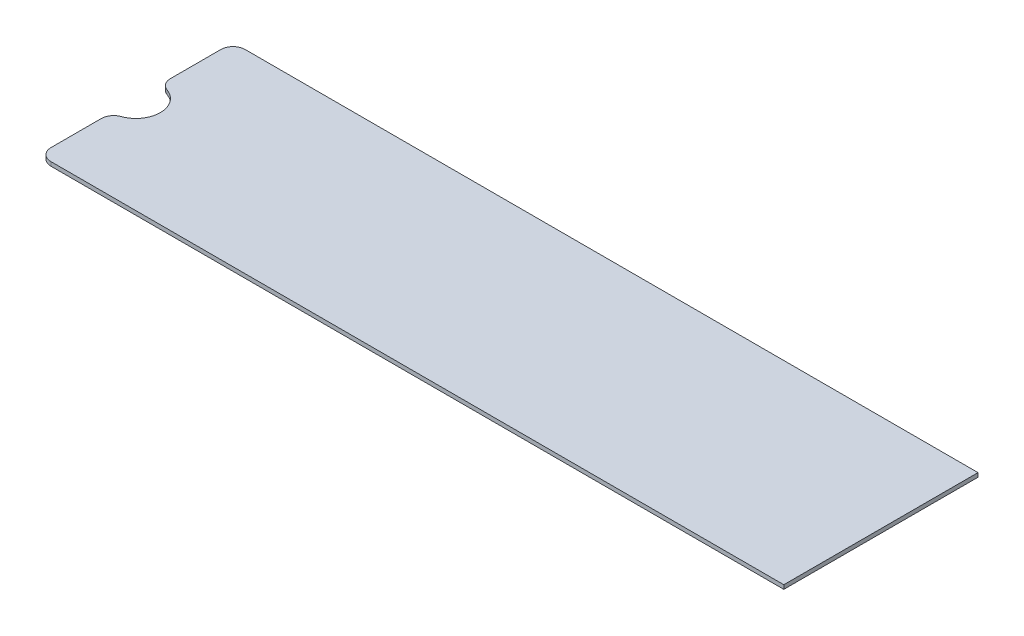
ISO-10303-21;
HEADER;
FILE_DESCRIPTION(('STEP AP214'),'2;1');
FILE_NAME('part.step','',(''),(''),'','','');
FILE_SCHEMA(('AUTOMOTIVE_DESIGN { 1 0 10303 214 1 1 1 1 }'));
ENDSEC;
DATA;
#1=APPLICATION_CONTEXT('core data for automotive mechanical design processes');
#2=APPLICATION_PROTOCOL_DEFINITION('international standard','automotive_design',2000,#1);
#3=PRODUCT_CONTEXT('',#1,'mechanical');
#4=PRODUCT('Part','Part','',(#3));
#5=PRODUCT_RELATED_PRODUCT_CATEGORY('part','',(#4));
#6=PRODUCT_DEFINITION_FORMATION('','',#4);
#7=PRODUCT_DEFINITION_CONTEXT('part definition',#1,'design');
#8=PRODUCT_DEFINITION('design','',#6,#7);
#9=PRODUCT_DEFINITION_SHAPE('','',#8);
#10=(LENGTH_UNIT() NAMED_UNIT(*) SI_UNIT(.MILLI.,.METRE.));
#11=(NAMED_UNIT(*) PLANE_ANGLE_UNIT() SI_UNIT($,.RADIAN.));
#12=(NAMED_UNIT(*) SI_UNIT($,.STERADIAN.) SOLID_ANGLE_UNIT());
#13=UNCERTAINTY_MEASURE_WITH_UNIT(LENGTH_MEASURE(1.E-05),#10,'distance_accuracy_value','');
#14=(GEOMETRIC_REPRESENTATION_CONTEXT(3) GLOBAL_UNCERTAINTY_ASSIGNED_CONTEXT((#13)) GLOBAL_UNIT_ASSIGNED_CONTEXT((#10,
#11,#12)) REPRESENTATION_CONTEXT('',''));
#15=CARTESIAN_POINT('',(0.,0.,0.));
#16=DIRECTION('',(0.,0.,1.));
#17=DIRECTION('',(1.,0.,0.));
#18=AXIS2_PLACEMENT_3D('',#15,#16,#17);
#19=CARTESIAN_POINT('',(-305.,1.65,0.));
#20=DIRECTION('',(-1.,0.,0.));
#21=DIRECTION('',(0.,0.,1.));
#22=AXIS2_PLACEMENT_3D('',#19,#20,#21);
#23=PLANE('',#22);
#24=DIRECTION('',(0.,0.,-1.));
#25=VECTOR('',#24,1.);
#26=CARTESIAN_POINT('',(-305.,1.65,0.));
#27=LINE('',#26,#25);
#28=CARTESIAN_POINT('',(-305.,1.65,-28.2842712474619));
#29=VERTEX_POINT('',#28);
#30=CARTESIAN_POINT('',(-305.,1.65,-69.5));
#31=VERTEX_POINT('',#30);
#32=EDGE_CURVE('E150',#29,#31,#27,.T.);
#33=ORIENTED_EDGE('',*,*,#32,.T.);
#34=DIRECTION('',(0.,-1.,0.));
#35=VECTOR('',#34,1.);
#36=CARTESIAN_POINT('',(-305.,1.65,-69.5));
#37=LINE('',#36,#35);
#38=CARTESIAN_POINT('',(-305.,-1.65,-69.5));
#39=VERTEX_POINT('',#38);
#40=EDGE_CURVE('E153',#31,#39,#37,.T.);
#41=ORIENTED_EDGE('',*,*,#40,.T.);
#42=DIRECTION('',(0.,0.,-1.));
#43=VECTOR('',#42,1.);
#44=CARTESIAN_POINT('',(-305.,-1.65,0.));
#45=LINE('',#44,#43);
#46=CARTESIAN_POINT('',(-305.,-1.65,-28.2842712474619));
#47=VERTEX_POINT('',#46);
#48=EDGE_CURVE('E142',#47,#39,#45,.T.);
#49=ORIENTED_EDGE('',*,*,#48,.F.);
#50=DIRECTION('',(0.,1.,0.));
#51=VECTOR('',#50,1.);
#52=CARTESIAN_POINT('',(-305.,1.65,-28.2842712474619));
#53=LINE('',#52,#51);
#54=EDGE_CURVE('E128',#47,#29,#53,.T.);
#55=ORIENTED_EDGE('',*,*,#54,.T.);
#56=EDGE_LOOP('',(#33,#41,#49,#55));
#57=FACE_BOUND('',#56,.T.);
#58=ADVANCED_FACE('F33',(#57),#23,.T.);
#59=CARTESIAN_POINT('',(-305.,1.65,0.));
#60=DIRECTION('',(0.,-1.,0.));
#61=DIRECTION('',(0.,0.,-1.));
#62=AXIS2_PLACEMENT_3D('',#59,#60,#61);
#63=CYLINDRICAL_SURFACE('',#62,20.);
#64=CARTESIAN_POINT('',(-305.,1.65,0.));
#65=DIRECTION('',(0.,1.,0.));
#66=DIRECTION('',(0.,0.,1.));
#67=AXIS2_PLACEMENT_3D('',#64,#65,#66);
#68=CIRCLE('',#67,20.);
#69=CARTESIAN_POINT('',(-298.333333333333,1.65,-18.8561808316412));
#70=VERTEX_POINT('',#69);
#71=CARTESIAN_POINT('',(-298.333333333333,1.65,18.8561808316413));
#72=VERTEX_POINT('',#71);
#73=EDGE_CURVE('E190',#70,#72,#68,.F.);
#74=ORIENTED_EDGE('',*,*,#73,.F.);
#75=DIRECTION('',(0.,-1.,0.));
#76=VECTOR('',#75,1.);
#77=CARTESIAN_POINT('',(-298.333333333333,1.65,-18.8561808316412));
#78=LINE('',#77,#76);
#79=CARTESIAN_POINT('',(-298.333333333333,-1.65,-18.8561808316412));
#80=VERTEX_POINT('',#79);
#81=EDGE_CURVE('E174',#70,#80,#78,.T.);
#82=ORIENTED_EDGE('',*,*,#81,.T.);
#83=CARTESIAN_POINT('',(-305.,-1.65,0.));
#84=DIRECTION('',(0.,1.,0.));
#85=DIRECTION('',(0.,0.,1.));
#86=AXIS2_PLACEMENT_3D('',#83,#84,#85);
#87=CIRCLE('',#86,20.);
#88=CARTESIAN_POINT('',(-298.333333333333,-1.65,18.8561808316413));
#89=VERTEX_POINT('',#88);
#90=EDGE_CURVE('E141',#80,#89,#87,.F.);
#91=ORIENTED_EDGE('',*,*,#90,.T.);
#92=DIRECTION('',(0.,-1.,0.));
#93=VECTOR('',#92,1.);
#94=CARTESIAN_POINT('',(-298.333333333333,1.65,18.8561808316413));
#95=LINE('',#94,#93);
#96=EDGE_CURVE('E172',#89,#72,#95,.F.);
#97=ORIENTED_EDGE('',*,*,#96,.T.);
#98=EDGE_LOOP('',(#74,#82,#91,#97));
#99=FACE_BOUND('',#98,.T.);
#100=ADVANCED_FACE('F216',(#99),#63,.F.);
#101=CARTESIAN_POINT('',(-305.,1.65,69.5));
#102=VERTEX_POINT('',#101);
#103=CARTESIAN_POINT('',(-305.,1.65,28.2842712474619));
#104=VERTEX_POINT('',#103);
#105=EDGE_CURVE('E118',#102,#104,#27,.T.);
#106=ORIENTED_EDGE('',*,*,#105,.T.);
#107=DIRECTION('',(0.,1.,0.));
#108=VECTOR('',#107,1.);
#109=CARTESIAN_POINT('',(-305.,-1.65,28.2842712474619));
#110=LINE('',#109,#108);
#111=CARTESIAN_POINT('',(-305.,-1.65,28.2842712474619));
#112=VERTEX_POINT('',#111);
#113=EDGE_CURVE('E41',#104,#112,#110,.F.);
#114=ORIENTED_EDGE('',*,*,#113,.T.);
#115=CARTESIAN_POINT('',(-305.,-1.65,69.5));
#116=VERTEX_POINT('',#115);
#117=EDGE_CURVE('E138',#116,#112,#45,.T.);
#118=ORIENTED_EDGE('',*,*,#117,.F.);
#119=DIRECTION('',(0.,-1.,0.));
#120=VECTOR('',#119,1.);
#121=CARTESIAN_POINT('',(-305.,1.65,69.5));
#122=LINE('',#121,#120);
#123=EDGE_CURVE('E177',#116,#102,#122,.F.);
#124=ORIENTED_EDGE('',*,*,#123,.T.);
#125=EDGE_LOOP('',(#106,#114,#118,#124));
#126=FACE_BOUND('',#125,.T.);
#127=ADVANCED_FACE('F182',(#126),#23,.T.);
#128=CARTESIAN_POINT('',(0.,1.65,79.5));
#129=DIRECTION('',(0.,0.,-1.));
#130=DIRECTION('',(-1.,0.,0.));
#131=AXIS2_PLACEMENT_3D('',#128,#129,#130);
#132=PLANE('',#131);
#133=DIRECTION('',(1.,0.,0.));
#134=VECTOR('',#133,1.);
#135=CARTESIAN_POINT('',(0.,1.65,79.5));
#136=LINE('',#135,#134);
#137=CARTESIAN_POINT('',(-295.,1.65,79.5));
#138=VERTEX_POINT('',#137);
#139=CARTESIAN_POINT('',(305.,1.65,79.5));
#140=VERTEX_POINT('',#139);
#141=EDGE_CURVE('E109',#138,#140,#136,.T.);
#142=ORIENTED_EDGE('',*,*,#141,.F.);
#143=DIRECTION('',(0.,-1.,0.));
#144=VECTOR('',#143,1.);
#145=CARTESIAN_POINT('',(-295.,-1.65,79.5));
#146=LINE('',#145,#144);
#147=CARTESIAN_POINT('',(-295.,-1.65,79.5));
#148=VERTEX_POINT('',#147);
#149=EDGE_CURVE('E11',#138,#148,#146,.T.);
#150=ORIENTED_EDGE('',*,*,#149,.T.);
#151=DIRECTION('',(1.,0.,0.));
#152=VECTOR('',#151,1.);
#153=CARTESIAN_POINT('',(0.,-1.65,79.5));
#154=LINE('',#153,#152);
#155=CARTESIAN_POINT('',(305.,-1.65,79.5));
#156=VERTEX_POINT('',#155);
#157=EDGE_CURVE('E124',#148,#156,#154,.T.);
#158=ORIENTED_EDGE('',*,*,#157,.T.);
#159=DIRECTION('',(0.,-1.,0.));
#160=VECTOR('',#159,1.);
#161=CARTESIAN_POINT('',(305.,1.65,79.5));
#162=LINE('',#161,#160);
#163=EDGE_CURVE('E121',#140,#156,#162,.T.);
#164=ORIENTED_EDGE('',*,*,#163,.F.);
#165=EDGE_LOOP('',(#142,#150,#158,#164));
#166=FACE_BOUND('',#165,.T.);
#167=ADVANCED_FACE('F122',(#166),#132,.F.);
#168=CARTESIAN_POINT('',(305.,1.65,0.));
#169=DIRECTION('',(-1.,0.,0.));
#170=DIRECTION('',(0.,0.,1.));
#171=AXIS2_PLACEMENT_3D('',#168,#169,#170);
#172=PLANE('',#171);
#173=DIRECTION('',(0.,0.,-1.));
#174=VECTOR('',#173,1.);
#175=CARTESIAN_POINT('',(305.,-1.65,0.));
#176=LINE('',#175,#174);
#177=CARTESIAN_POINT('',(305.,-1.65,-79.5));
#178=VERTEX_POINT('',#177);
#179=EDGE_CURVE('E146',#156,#178,#176,.T.);
#180=ORIENTED_EDGE('',*,*,#179,.T.);
#181=DIRECTION('',(0.,-1.,0.));
#182=VECTOR('',#181,1.);
#183=CARTESIAN_POINT('',(305.,1.65,-79.5));
#184=LINE('',#183,#182);
#185=CARTESIAN_POINT('',(305.,1.65,-79.5));
#186=VERTEX_POINT('',#185);
#187=EDGE_CURVE('E129',#186,#178,#184,.T.);
#188=ORIENTED_EDGE('',*,*,#187,.F.);
#189=DIRECTION('',(0.,0.,-1.));
#190=VECTOR('',#189,1.);
#191=CARTESIAN_POINT('',(305.,1.65,0.));
#192=LINE('',#191,#190);
#193=EDGE_CURVE('E114',#140,#186,#192,.T.);
#194=ORIENTED_EDGE('',*,*,#193,.F.);
#195=ORIENTED_EDGE('',*,*,#163,.T.);
#196=EDGE_LOOP('',(#180,#188,#194,#195));
#197=FACE_BOUND('',#196,.T.);
#198=ADVANCED_FACE('F131',(#197),#172,.F.);
#199=CARTESIAN_POINT('',(0.,1.65,-79.5));
#200=DIRECTION('',(0.,0.,-1.));
#201=DIRECTION('',(-1.,0.,0.));
#202=AXIS2_PLACEMENT_3D('',#199,#200,#201);
#203=PLANE('',#202);
#204=DIRECTION('',(1.,0.,0.));
#205=VECTOR('',#204,1.);
#206=CARTESIAN_POINT('',(0.,-1.65,-79.5));
#207=LINE('',#206,#205);
#208=CARTESIAN_POINT('',(-295.,-1.65,-79.5));
#209=VERTEX_POINT('',#208);
#210=EDGE_CURVE('E148',#209,#178,#207,.T.);
#211=ORIENTED_EDGE('',*,*,#210,.F.);
#212=DIRECTION('',(0.,-1.,0.));
#213=VECTOR('',#212,1.);
#214=CARTESIAN_POINT('',(-295.,1.65,-79.5));
#215=LINE('',#214,#213);
#216=CARTESIAN_POINT('',(-295.,1.65,-79.5));
#217=VERTEX_POINT('',#216);
#218=EDGE_CURVE('E164',#209,#217,#215,.F.);
#219=ORIENTED_EDGE('',*,*,#218,.T.);
#220=DIRECTION('',(1.,0.,0.));
#221=VECTOR('',#220,1.);
#222=CARTESIAN_POINT('',(0.,1.65,-79.5));
#223=LINE('',#222,#221);
#224=EDGE_CURVE('E133',#217,#186,#223,.T.);
#225=ORIENTED_EDGE('',*,*,#224,.T.);
#226=ORIENTED_EDGE('',*,*,#187,.T.);
#227=EDGE_LOOP('',(#211,#219,#225,#226));
#228=FACE_BOUND('',#227,.T.);
#229=ADVANCED_FACE('F205',(#228),#203,.T.);
#230=CARTESIAN_POINT('',(0.,1.65,0.));
#231=DIRECTION('',(0.,1.,0.));
#232=DIRECTION('',(0.,0.,1.));
#233=AXIS2_PLACEMENT_3D('',#230,#231,#232);
#234=PLANE('',#233);
#235=ORIENTED_EDGE('',*,*,#224,.F.);
#236=CARTESIAN_POINT('',(-295.,1.65,-69.5));
#237=DIRECTION('',(0.,1.,0.));
#238=DIRECTION('',(0.,0.,1.));
#239=AXIS2_PLACEMENT_3D('',#236,#237,#238);
#240=CIRCLE('',#239,10.);
#241=EDGE_CURVE('E170',#217,#31,#240,.T.);
#242=ORIENTED_EDGE('',*,*,#241,.T.);
#243=ORIENTED_EDGE('',*,*,#32,.F.);
#244=CARTESIAN_POINT('',(-295.,1.65,-28.2842712474619));
#245=DIRECTION('',(0.,1.,0.));
#246=DIRECTION('',(0.,0.,1.));
#247=AXIS2_PLACEMENT_3D('',#244,#245,#246);
#248=CIRCLE('',#247,10.);
#249=EDGE_CURVE('E168',#29,#70,#248,.T.);
#250=ORIENTED_EDGE('',*,*,#249,.T.);
#251=ORIENTED_EDGE('',*,*,#73,.T.);
#252=CARTESIAN_POINT('',(-295.,1.65,28.2842712474619));
#253=DIRECTION('',(0.,1.,0.));
#254=DIRECTION('',(0.,0.,1.));
#255=AXIS2_PLACEMENT_3D('',#252,#253,#254);
#256=CIRCLE('',#255,10.);
#257=EDGE_CURVE('E54',#72,#104,#256,.T.);
#258=ORIENTED_EDGE('',*,*,#257,.T.);
#259=ORIENTED_EDGE('',*,*,#105,.F.);
#260=CARTESIAN_POINT('',(-295.,1.65,69.5));
#261=DIRECTION('',(0.,1.,0.));
#262=DIRECTION('',(0.,0.,1.));
#263=AXIS2_PLACEMENT_3D('',#260,#261,#262);
#264=CIRCLE('',#263,10.);
#265=EDGE_CURVE('E48',#102,#138,#264,.T.);
#266=ORIENTED_EDGE('',*,*,#265,.T.);
#267=ORIENTED_EDGE('',*,*,#141,.T.);
#268=ORIENTED_EDGE('',*,*,#193,.T.);
#269=EDGE_LOOP('',(#235,#242,#243,#250,#251,#258,#259,#266,#267,#268));
#270=FACE_BOUND('',#269,.T.);
#271=ADVANCED_FACE('F112',(#270),#234,.T.);
#272=CARTESIAN_POINT('',(0.,-1.65,0.));
#273=DIRECTION('',(0.,1.,0.));
#274=DIRECTION('',(0.,0.,1.));
#275=AXIS2_PLACEMENT_3D('',#272,#273,#274);
#276=PLANE('',#275);
#277=ORIENTED_EDGE('',*,*,#48,.T.);
#278=CARTESIAN_POINT('',(-295.,-1.65,-69.5));
#279=DIRECTION('',(0.,1.,0.));
#280=DIRECTION('',(0.,0.,1.));
#281=AXIS2_PLACEMENT_3D('',#278,#279,#280);
#282=CIRCLE('',#281,10.);
#283=EDGE_CURVE('E162',#39,#209,#282,.F.);
#284=ORIENTED_EDGE('',*,*,#283,.T.);
#285=ORIENTED_EDGE('',*,*,#210,.T.);
#286=ORIENTED_EDGE('',*,*,#179,.F.);
#287=ORIENTED_EDGE('',*,*,#157,.F.);
#288=CARTESIAN_POINT('',(-295.,-1.65,69.5));
#289=DIRECTION('',(0.,1.,0.));
#290=DIRECTION('',(0.,0.,1.));
#291=AXIS2_PLACEMENT_3D('',#288,#289,#290);
#292=CIRCLE('',#291,10.);
#293=EDGE_CURVE('E156',#148,#116,#292,.F.);
#294=ORIENTED_EDGE('',*,*,#293,.T.);
#295=ORIENTED_EDGE('',*,*,#117,.T.);
#296=CARTESIAN_POINT('',(-295.,-1.65,28.2842712474619));
#297=DIRECTION('',(0.,1.,0.));
#298=DIRECTION('',(0.,0.,1.));
#299=AXIS2_PLACEMENT_3D('',#296,#297,#298);
#300=CIRCLE('',#299,10.);
#301=EDGE_CURVE('E158',#112,#89,#300,.F.);
#302=ORIENTED_EDGE('',*,*,#301,.T.);
#303=ORIENTED_EDGE('',*,*,#90,.F.);
#304=CARTESIAN_POINT('',(-295.,-1.65,-28.2842712474619));
#305=DIRECTION('',(0.,1.,0.));
#306=DIRECTION('',(0.,0.,1.));
#307=AXIS2_PLACEMENT_3D('',#304,#305,#306);
#308=CIRCLE('',#307,10.);
#309=EDGE_CURVE('E160',#80,#47,#308,.F.);
#310=ORIENTED_EDGE('',*,*,#309,.T.);
#311=EDGE_LOOP('',(#277,#284,#285,#286,#287,#294,#295,#302,#303,#310));
#312=FACE_BOUND('',#311,.T.);
#313=ADVANCED_FACE('F187',(#312),#276,.F.);
#314=CARTESIAN_POINT('',(-295.,1.65,-69.5));
#315=DIRECTION('',(0.,-1.,0.));
#316=DIRECTION('',(0.,0.,-1.));
#317=AXIS2_PLACEMENT_3D('',#314,#315,#316);
#318=CYLINDRICAL_SURFACE('',#317,10.);
#319=ORIENTED_EDGE('',*,*,#241,.F.);
#320=ORIENTED_EDGE('',*,*,#218,.F.);
#321=ORIENTED_EDGE('',*,*,#283,.F.);
#322=ORIENTED_EDGE('',*,*,#40,.F.);
#323=EDGE_LOOP('',(#319,#320,#321,#322));
#324=FACE_BOUND('',#323,.T.);
#325=ADVANCED_FACE('F201',(#324),#318,.T.);
#326=CARTESIAN_POINT('',(-295.,1.65,-28.2842712474619));
#327=DIRECTION('',(0.,-1.,0.));
#328=DIRECTION('',(0.,0.,-1.));
#329=AXIS2_PLACEMENT_3D('',#326,#327,#328);
#330=CYLINDRICAL_SURFACE('',#329,10.);
#331=ORIENTED_EDGE('',*,*,#249,.F.);
#332=ORIENTED_EDGE('',*,*,#54,.F.);
#333=ORIENTED_EDGE('',*,*,#309,.F.);
#334=ORIENTED_EDGE('',*,*,#81,.F.);
#335=EDGE_LOOP('',(#331,#332,#333,#334));
#336=FACE_BOUND('',#335,.T.);
#337=ADVANCED_FACE('F275',(#336),#330,.T.);
#338=CARTESIAN_POINT('',(-295.,1.65,28.2842712474619));
#339=DIRECTION('',(0.,-1.,0.));
#340=DIRECTION('',(0.,0.,-1.));
#341=AXIS2_PLACEMENT_3D('',#338,#339,#340);
#342=CYLINDRICAL_SURFACE('',#341,10.);
#343=ORIENTED_EDGE('',*,*,#257,.F.);
#344=ORIENTED_EDGE('',*,*,#96,.F.);
#345=ORIENTED_EDGE('',*,*,#301,.F.);
#346=ORIENTED_EDGE('',*,*,#113,.F.);
#347=EDGE_LOOP('',(#343,#344,#345,#346));
#348=FACE_BOUND('',#347,.T.);
#349=ADVANCED_FACE('F283',(#348),#342,.T.);
#350=CARTESIAN_POINT('',(-295.,1.65,69.5));
#351=DIRECTION('',(0.,1.,0.));
#352=DIRECTION('',(0.,0.,1.));
#353=AXIS2_PLACEMENT_3D('',#350,#351,#352);
#354=CYLINDRICAL_SURFACE('',#353,10.);
#355=ORIENTED_EDGE('',*,*,#265,.F.);
#356=ORIENTED_EDGE('',*,*,#123,.F.);
#357=ORIENTED_EDGE('',*,*,#293,.F.);
#358=ORIENTED_EDGE('',*,*,#149,.F.);
#359=EDGE_LOOP('',(#355,#356,#357,#358));
#360=FACE_BOUND('',#359,.T.);
#361=ADVANCED_FACE('F35',(#360),#354,.T.);
#362=CLOSED_SHELL('',(#58,#100,#127,#167,#198,#229,#271,#313,#325,#337,#349,#361));
#363=MANIFOLD_SOLID_BREP('B2',#362);
#364=ADVANCED_BREP_SHAPE_REPRESENTATION('',(#18,#363),#14);
#365=SHAPE_DEFINITION_REPRESENTATION(#9,#364);
ENDSEC;
END-ISO-10303-21;
